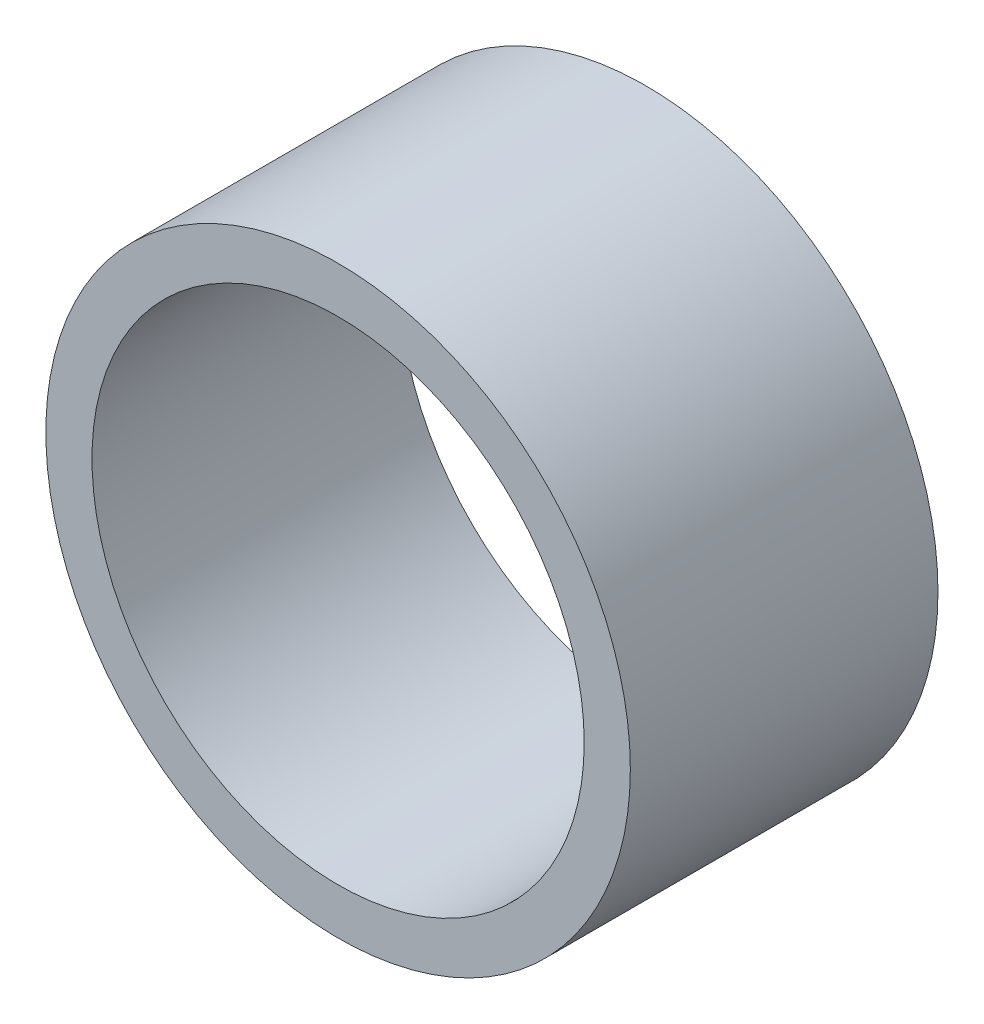
ISO-10303-21;
HEADER;
FILE_DESCRIPTION(('STEP AP214'),'2;1');
FILE_NAME('part.step','',(''),(''),'','','');
FILE_SCHEMA(('AUTOMOTIVE_DESIGN { 1 0 10303 214 1 1 1 1 }'));
ENDSEC;
DATA;
#1=APPLICATION_CONTEXT('core data for automotive mechanical design processes');
#2=APPLICATION_PROTOCOL_DEFINITION('international standard','automotive_design',2000,#1);
#3=PRODUCT_CONTEXT('',#1,'mechanical');
#4=PRODUCT('Part','Part','',(#3));
#5=PRODUCT_RELATED_PRODUCT_CATEGORY('part','',(#4));
#6=PRODUCT_DEFINITION_FORMATION('','',#4);
#7=PRODUCT_DEFINITION_CONTEXT('part definition',#1,'design');
#8=PRODUCT_DEFINITION('design','',#6,#7);
#9=PRODUCT_DEFINITION_SHAPE('','',#8);
#10=(LENGTH_UNIT() NAMED_UNIT(*) SI_UNIT(.MILLI.,.METRE.));
#11=(NAMED_UNIT(*) PLANE_ANGLE_UNIT() SI_UNIT($,.RADIAN.));
#12=(NAMED_UNIT(*) SI_UNIT($,.STERADIAN.) SOLID_ANGLE_UNIT());
#13=UNCERTAINTY_MEASURE_WITH_UNIT(LENGTH_MEASURE(1.E-05),#10,'distance_accuracy_value','');
#14=(GEOMETRIC_REPRESENTATION_CONTEXT(3) GLOBAL_UNCERTAINTY_ASSIGNED_CONTEXT((#13)) GLOBAL_UNIT_ASSIGNED_CONTEXT((#10,
#11,#12)) REPRESENTATION_CONTEXT('',''));
#15=CARTESIAN_POINT('',(0.,0.,0.));
#16=DIRECTION('',(0.,0.,1.));
#17=DIRECTION('',(1.,0.,0.));
#18=AXIS2_PLACEMENT_3D('',#15,#16,#17);
#19=CARTESIAN_POINT('',(0.,0.,10.));
#20=DIRECTION('',(0.,0.,1.));
#21=DIRECTION('',(1.,0.,0.));
#22=AXIS2_PLACEMENT_3D('',#19,#20,#21);
#23=PLANE('',#22);
#24=CARTESIAN_POINT('',(0.,0.,10.));
#25=DIRECTION('',(0.,0.,1.));
#26=DIRECTION('',(1.,0.,0.));
#27=AXIS2_PLACEMENT_3D('',#24,#25,#26);
#28=CIRCLE('',#27,9.5);
#29=CARTESIAN_POINT('',(9.5,0.,10.));
#30=VERTEX_POINT('',#29);
#31=EDGE_CURVE('E10',#30,#30,#28,.T.);
#32=ORIENTED_EDGE('',*,*,#31,.T.);
#33=EDGE_LOOP('',(#32));
#34=FACE_BOUND('',#33,.T.);
#35=CARTESIAN_POINT('',(0.,0.,10.));
#36=DIRECTION('',(0.,0.,1.));
#37=DIRECTION('',(1.,0.,0.));
#38=AXIS2_PLACEMENT_3D('',#35,#36,#37);
#39=CIRCLE('',#38,8.);
#40=CARTESIAN_POINT('',(8.,0.,10.));
#41=VERTEX_POINT('',#40);
#42=EDGE_CURVE('E48',#41,#41,#39,.T.);
#43=ORIENTED_EDGE('',*,*,#42,.F.);
#44=EDGE_LOOP('',(#43));
#45=FACE_BOUND('',#44,.T.);
#46=ADVANCED_FACE('F40',(#34,#45),#23,.T.);
#47=CARTESIAN_POINT('',(0.,0.,0.));
#48=DIRECTION('',(0.,0.,1.));
#49=DIRECTION('',(1.,0.,0.));
#50=AXIS2_PLACEMENT_3D('',#47,#48,#49);
#51=PLANE('',#50);
#52=CARTESIAN_POINT('',(0.,0.,0.));
#53=DIRECTION('',(0.,0.,1.));
#54=DIRECTION('',(1.,0.,0.));
#55=AXIS2_PLACEMENT_3D('',#52,#53,#54);
#56=CIRCLE('',#55,9.5);
#57=CARTESIAN_POINT('',(9.5,0.,0.));
#58=VERTEX_POINT('',#57);
#59=EDGE_CURVE('E41',#58,#58,#56,.T.);
#60=ORIENTED_EDGE('',*,*,#59,.F.);
#61=EDGE_LOOP('',(#60));
#62=FACE_BOUND('',#61,.T.);
#63=CARTESIAN_POINT('',(0.,0.,0.));
#64=DIRECTION('',(0.,0.,1.));
#65=DIRECTION('',(1.,0.,0.));
#66=AXIS2_PLACEMENT_3D('',#63,#64,#65);
#67=CIRCLE('',#66,8.);
#68=CARTESIAN_POINT('',(8.,0.,0.));
#69=VERTEX_POINT('',#68);
#70=EDGE_CURVE('E49',#69,#69,#67,.T.);
#71=ORIENTED_EDGE('',*,*,#70,.T.);
#72=EDGE_LOOP('',(#71));
#73=FACE_BOUND('',#72,.T.);
#74=ADVANCED_FACE('F58',(#62,#73),#51,.F.);
#75=CARTESIAN_POINT('',(0.,0.,10.));
#76=DIRECTION('',(0.,0.,-1.));
#77=DIRECTION('',(-1.,0.,0.));
#78=AXIS2_PLACEMENT_3D('',#75,#76,#77);
#79=CYLINDRICAL_SURFACE('',#78,9.5);
#80=ORIENTED_EDGE('',*,*,#31,.F.);
#81=EDGE_LOOP('',(#80));
#82=FACE_BOUND('',#81,.T.);
#83=ORIENTED_EDGE('',*,*,#59,.T.);
#84=EDGE_LOOP('',(#83));
#85=FACE_BOUND('',#84,.T.);
#86=ADVANCED_FACE('F39',(#82,#85),#79,.T.);
#87=CARTESIAN_POINT('',(0.,0.,10.));
#88=DIRECTION('',(0.,0.,-1.));
#89=DIRECTION('',(-1.,0.,0.));
#90=AXIS2_PLACEMENT_3D('',#87,#88,#89);
#91=CYLINDRICAL_SURFACE('',#90,8.);
#92=ORIENTED_EDGE('',*,*,#42,.T.);
#93=EDGE_LOOP('',(#92));
#94=FACE_BOUND('',#93,.T.);
#95=ORIENTED_EDGE('',*,*,#70,.F.);
#96=EDGE_LOOP('',(#95));
#97=FACE_BOUND('',#96,.T.);
#98=ADVANCED_FACE('F57',(#94,#97),#91,.F.);
#99=CLOSED_SHELL('',(#46,#74,#86,#98));
#100=MANIFOLD_SOLID_BREP('B2',#99);
#101=ADVANCED_BREP_SHAPE_REPRESENTATION('',(#18,#100),#14);
#102=SHAPE_DEFINITION_REPRESENTATION(#9,#101);
ENDSEC;
END-ISO-10303-21;
